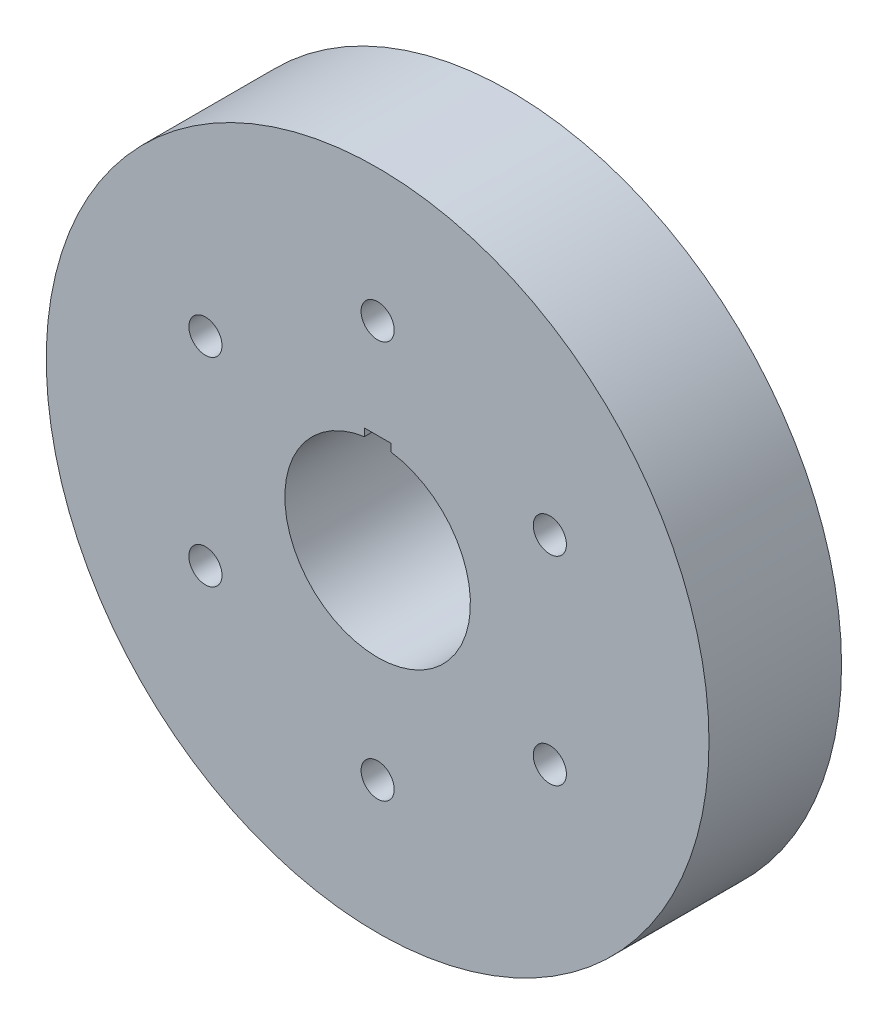
ISO-10303-21;
HEADER;
FILE_DESCRIPTION(('STEP AP214'),'2;1');
FILE_NAME('part.step','',(''),(''),'','','');
FILE_SCHEMA(('AUTOMOTIVE_DESIGN { 1 0 10303 214 1 1 1 1 }'));
ENDSEC;
DATA;
#1=APPLICATION_CONTEXT('core data for automotive mechanical design processes');
#2=APPLICATION_PROTOCOL_DEFINITION('international standard','automotive_design',2000,#1);
#3=PRODUCT_CONTEXT('',#1,'mechanical');
#4=PRODUCT('Part','Part','',(#3));
#5=PRODUCT_RELATED_PRODUCT_CATEGORY('part','',(#4));
#6=PRODUCT_DEFINITION_FORMATION('','',#4);
#7=PRODUCT_DEFINITION_CONTEXT('part definition',#1,'design');
#8=PRODUCT_DEFINITION('design','',#6,#7);
#9=PRODUCT_DEFINITION_SHAPE('','',#8);
#10=(LENGTH_UNIT() NAMED_UNIT(*) SI_UNIT(.MILLI.,.METRE.));
#11=(NAMED_UNIT(*) PLANE_ANGLE_UNIT() SI_UNIT($,.RADIAN.));
#12=(NAMED_UNIT(*) SI_UNIT($,.STERADIAN.) SOLID_ANGLE_UNIT());
#13=UNCERTAINTY_MEASURE_WITH_UNIT(LENGTH_MEASURE(1.E-05),#10,'distance_accuracy_value','');
#14=(GEOMETRIC_REPRESENTATION_CONTEXT(3) GLOBAL_UNCERTAINTY_ASSIGNED_CONTEXT((#13)) GLOBAL_UNIT_ASSIGNED_CONTEXT((#10,
#11,#12)) REPRESENTATION_CONTEXT('',''));
#15=CARTESIAN_POINT('',(0.,0.,0.));
#16=DIRECTION('',(0.,0.,1.));
#17=DIRECTION('',(1.,0.,0.));
#18=AXIS2_PLACEMENT_3D('',#15,#16,#17);
#19=CARTESIAN_POINT('',(0.,0.,20.));
#20=DIRECTION('',(0.,0.,1.));
#21=DIRECTION('',(1.,0.,0.));
#22=AXIS2_PLACEMENT_3D('',#19,#20,#21);
#23=PLANE('',#22);
#24=CARTESIAN_POINT('',(25.980762113533,-15.0000000000003,20.));
#25=DIRECTION('',(0.,0.,1.));
#26=DIRECTION('',(1.,0.,0.));
#27=AXIS2_PLACEMENT_3D('',#24,#25,#26);
#28=CIRCLE('',#27,2.5);
#29=CARTESIAN_POINT('',(28.480762113533,-15.0000000000003,20.));
#30=VERTEX_POINT('',#29);
#31=EDGE_CURVE('E242',#30,#30,#28,.T.);
#32=ORIENTED_EDGE('',*,*,#31,.F.);
#33=EDGE_LOOP('',(#32));
#34=FACE_BOUND('',#33,.T.);
#35=CARTESIAN_POINT('',(25.9807621135333,14.9999999999998,20.));
#36=DIRECTION('',(0.,0.,1.));
#37=DIRECTION('',(1.,0.,0.));
#38=AXIS2_PLACEMENT_3D('',#35,#36,#37);
#39=CIRCLE('',#38,2.5);
#40=CARTESIAN_POINT('',(28.4807621135333,14.9999999999998,20.));
#41=VERTEX_POINT('',#40);
#42=EDGE_CURVE('E244',#41,#41,#39,.T.);
#43=ORIENTED_EDGE('',*,*,#42,.F.);
#44=EDGE_LOOP('',(#43));
#45=FACE_BOUND('',#44,.T.);
#46=CARTESIAN_POINT('',(2.09489001666563E-13,30.,20.));
#47=DIRECTION('',(0.,0.,1.));
#48=DIRECTION('',(1.,0.,0.));
#49=AXIS2_PLACEMENT_3D('',#46,#47,#48);
#50=CIRCLE('',#49,2.5);
#51=CARTESIAN_POINT('',(2.50000000000021,30.,20.));
#52=VERTEX_POINT('',#51);
#53=EDGE_CURVE('E250',#52,#52,#50,.T.);
#54=ORIENTED_EDGE('',*,*,#53,.F.);
#55=EDGE_LOOP('',(#54));
#56=FACE_BOUND('',#55,.T.);
#57=CARTESIAN_POINT('',(-25.9807621135331,15.0000000000001,20.));
#58=DIRECTION('',(0.,0.,1.));
#59=DIRECTION('',(1.,0.,0.));
#60=AXIS2_PLACEMENT_3D('',#57,#58,#59);
#61=CIRCLE('',#60,2.5);
#62=CARTESIAN_POINT('',(-23.4807621135331,15.0000000000001,20.));
#63=VERTEX_POINT('',#62);
#64=EDGE_CURVE('E256',#63,#63,#61,.T.);
#65=ORIENTED_EDGE('',*,*,#64,.F.);
#66=EDGE_LOOP('',(#65));
#67=FACE_BOUND('',#66,.T.);
#68=CARTESIAN_POINT('',(-25.9807621135332,-14.9999999999999,20.));
#69=DIRECTION('',(0.,0.,1.));
#70=DIRECTION('',(1.,0.,0.));
#71=AXIS2_PLACEMENT_3D('',#68,#69,#70);
#72=CIRCLE('',#71,2.5);
#73=CARTESIAN_POINT('',(-23.4807621135332,-14.9999999999999,20.));
#74=VERTEX_POINT('',#73);
#75=EDGE_CURVE('E262',#74,#74,#72,.T.);
#76=ORIENTED_EDGE('',*,*,#75,.F.);
#77=EDGE_LOOP('',(#76));
#78=FACE_BOUND('',#77,.T.);
#79=CARTESIAN_POINT('',(0.,-30.,20.));
#80=DIRECTION('',(0.,0.,1.));
#81=DIRECTION('',(1.,0.,0.));
#82=AXIS2_PLACEMENT_3D('',#79,#80,#81);
#83=CIRCLE('',#82,2.5);
#84=CARTESIAN_POINT('',(2.5,-30.,20.));
#85=VERTEX_POINT('',#84);
#86=EDGE_CURVE('E268',#85,#85,#83,.T.);
#87=ORIENTED_EDGE('',*,*,#86,.F.);
#88=EDGE_LOOP('',(#87));
#89=FACE_BOUND('',#88,.T.);
#90=CARTESIAN_POINT('',(0.,0.,20.));
#91=DIRECTION('',(0.,0.,1.));
#92=DIRECTION('',(1.,0.,0.));
#93=AXIS2_PLACEMENT_3D('',#90,#91,#92);
#94=CIRCLE('',#93,50.);
#95=CARTESIAN_POINT('',(50.,0.,20.));
#96=VERTEX_POINT('',#95);
#97=EDGE_CURVE('E11',#96,#96,#94,.T.);
#98=ORIENTED_EDGE('',*,*,#97,.T.);
#99=EDGE_LOOP('',(#98));
#100=FACE_BOUND('',#99,.T.);
#101=DIRECTION('',(0.,1.,0.));
#102=VECTOR('',#101,1.);
#103=CARTESIAN_POINT('',(2.,15.,20.));
#104=LINE('',#103,#102);
#105=CARTESIAN_POINT('',(2.,13.856406460551,20.));
#106=VERTEX_POINT('',#105);
#107=CARTESIAN_POINT('',(2.,15.,20.));
#108=VERTEX_POINT('',#107);
#109=EDGE_CURVE('E84',#106,#108,#104,.T.);
#110=ORIENTED_EDGE('',*,*,#109,.F.);
#111=CARTESIAN_POINT('',(0.,0.,20.));
#112=DIRECTION('',(0.,0.,1.));
#113=DIRECTION('',(1.,0.,0.));
#114=AXIS2_PLACEMENT_3D('',#111,#112,#113);
#115=CIRCLE('',#114,14.);
#116=CARTESIAN_POINT('',(-2.,13.856406460551,20.));
#117=VERTEX_POINT('',#116);
#118=EDGE_CURVE('E76',#117,#106,#115,.T.);
#119=ORIENTED_EDGE('',*,*,#118,.F.);
#120=DIRECTION('',(0.,-1.,0.));
#121=VECTOR('',#120,1.);
#122=CARTESIAN_POINT('',(-2.,13.856406460551,20.));
#123=LINE('',#122,#121);
#124=CARTESIAN_POINT('',(-2.,15.,20.));
#125=VERTEX_POINT('',#124);
#126=EDGE_CURVE('E97',#125,#117,#123,.T.);
#127=ORIENTED_EDGE('',*,*,#126,.F.);
#128=DIRECTION('',(-1.,0.,0.));
#129=VECTOR('',#128,1.);
#130=CARTESIAN_POINT('',(-2.,15.,20.));
#131=LINE('',#130,#129);
#132=EDGE_CURVE('E95',#108,#125,#131,.T.);
#133=ORIENTED_EDGE('',*,*,#132,.F.);
#134=EDGE_LOOP('',(#110,#119,#127,#133));
#135=FACE_BOUND('',#134,.T.);
#136=ADVANCED_FACE('F35',(#34,#45,#56,#67,#78,#89,#100,#135),#23,.T.);
#137=CARTESIAN_POINT('',(0.,0.,0.));
#138=DIRECTION('',(0.,0.,1.));
#139=DIRECTION('',(1.,0.,0.));
#140=AXIS2_PLACEMENT_3D('',#137,#138,#139);
#141=PLANE('',#140);
#142=CARTESIAN_POINT('',(25.980762113533,-15.0000000000003,0.));
#143=DIRECTION('',(0.,0.,1.));
#144=DIRECTION('',(1.,0.,0.));
#145=AXIS2_PLACEMENT_3D('',#142,#143,#144);
#146=CIRCLE('',#145,2.5);
#147=CARTESIAN_POINT('',(28.480762113533,-15.0000000000003,0.));
#148=VERTEX_POINT('',#147);
#149=EDGE_CURVE('E240',#148,#148,#146,.T.);
#150=ORIENTED_EDGE('',*,*,#149,.T.);
#151=EDGE_LOOP('',(#150));
#152=FACE_BOUND('',#151,.T.);
#153=CARTESIAN_POINT('',(25.9807621135333,14.9999999999998,0.));
#154=DIRECTION('',(0.,0.,1.));
#155=DIRECTION('',(1.,0.,0.));
#156=AXIS2_PLACEMENT_3D('',#153,#154,#155);
#157=CIRCLE('',#156,2.5);
#158=CARTESIAN_POINT('',(28.4807621135333,14.9999999999998,0.));
#159=VERTEX_POINT('',#158);
#160=EDGE_CURVE('E247',#159,#159,#157,.T.);
#161=ORIENTED_EDGE('',*,*,#160,.T.);
#162=EDGE_LOOP('',(#161));
#163=FACE_BOUND('',#162,.T.);
#164=CARTESIAN_POINT('',(2.09489001666563E-13,30.,0.));
#165=DIRECTION('',(0.,0.,1.));
#166=DIRECTION('',(1.,0.,0.));
#167=AXIS2_PLACEMENT_3D('',#164,#165,#166);
#168=CIRCLE('',#167,2.5);
#169=CARTESIAN_POINT('',(2.50000000000021,30.,0.));
#170=VERTEX_POINT('',#169);
#171=EDGE_CURVE('E253',#170,#170,#168,.T.);
#172=ORIENTED_EDGE('',*,*,#171,.T.);
#173=EDGE_LOOP('',(#172));
#174=FACE_BOUND('',#173,.T.);
#175=CARTESIAN_POINT('',(-25.9807621135331,15.0000000000001,0.));
#176=DIRECTION('',(0.,0.,1.));
#177=DIRECTION('',(1.,0.,0.));
#178=AXIS2_PLACEMENT_3D('',#175,#176,#177);
#179=CIRCLE('',#178,2.5);
#180=CARTESIAN_POINT('',(-23.4807621135331,15.0000000000001,0.));
#181=VERTEX_POINT('',#180);
#182=EDGE_CURVE('E259',#181,#181,#179,.T.);
#183=ORIENTED_EDGE('',*,*,#182,.T.);
#184=EDGE_LOOP('',(#183));
#185=FACE_BOUND('',#184,.T.);
#186=CARTESIAN_POINT('',(-25.9807621135332,-14.9999999999999,0.));
#187=DIRECTION('',(0.,0.,1.));
#188=DIRECTION('',(1.,0.,0.));
#189=AXIS2_PLACEMENT_3D('',#186,#187,#188);
#190=CIRCLE('',#189,2.5);
#191=CARTESIAN_POINT('',(-23.4807621135332,-14.9999999999999,0.));
#192=VERTEX_POINT('',#191);
#193=EDGE_CURVE('E265',#192,#192,#190,.T.);
#194=ORIENTED_EDGE('',*,*,#193,.T.);
#195=EDGE_LOOP('',(#194));
#196=FACE_BOUND('',#195,.T.);
#197=CARTESIAN_POINT('',(0.,-30.,0.));
#198=DIRECTION('',(0.,0.,1.));
#199=DIRECTION('',(1.,0.,0.));
#200=AXIS2_PLACEMENT_3D('',#197,#198,#199);
#201=CIRCLE('',#200,2.5);
#202=CARTESIAN_POINT('',(2.5,-30.,0.));
#203=VERTEX_POINT('',#202);
#204=EDGE_CURVE('E103',#203,#203,#201,.T.);
#205=ORIENTED_EDGE('',*,*,#204,.T.);
#206=EDGE_LOOP('',(#205));
#207=FACE_BOUND('',#206,.T.);
#208=CARTESIAN_POINT('',(0.,0.,0.));
#209=DIRECTION('',(0.,0.,1.));
#210=DIRECTION('',(1.,0.,0.));
#211=AXIS2_PLACEMENT_3D('',#208,#209,#210);
#212=CIRCLE('',#211,50.);
#213=CARTESIAN_POINT('',(50.,0.,0.));
#214=VERTEX_POINT('',#213);
#215=EDGE_CURVE('E39',#214,#214,#212,.T.);
#216=ORIENTED_EDGE('',*,*,#215,.F.);
#217=EDGE_LOOP('',(#216));
#218=FACE_BOUND('',#217,.T.);
#219=CARTESIAN_POINT('',(0.,0.,0.));
#220=DIRECTION('',(0.,0.,1.));
#221=DIRECTION('',(1.,0.,0.));
#222=AXIS2_PLACEMENT_3D('',#219,#220,#221);
#223=CIRCLE('',#222,14.);
#224=CARTESIAN_POINT('',(-2.,13.856406460551,0.));
#225=VERTEX_POINT('',#224);
#226=CARTESIAN_POINT('',(2.,13.856406460551,0.));
#227=VERTEX_POINT('',#226);
#228=EDGE_CURVE('E58',#225,#227,#223,.T.);
#229=ORIENTED_EDGE('',*,*,#228,.T.);
#230=DIRECTION('',(0.,1.,0.));
#231=VECTOR('',#230,1.);
#232=CARTESIAN_POINT('',(2.,15.,0.));
#233=LINE('',#232,#231);
#234=CARTESIAN_POINT('',(2.,15.,0.));
#235=VERTEX_POINT('',#234);
#236=EDGE_CURVE('E91',#227,#235,#233,.T.);
#237=ORIENTED_EDGE('',*,*,#236,.T.);
#238=DIRECTION('',(-1.,0.,0.));
#239=VECTOR('',#238,1.);
#240=CARTESIAN_POINT('',(-2.,15.,0.));
#241=LINE('',#240,#239);
#242=CARTESIAN_POINT('',(-2.,15.,0.));
#243=VERTEX_POINT('',#242);
#244=EDGE_CURVE('E105',#235,#243,#241,.T.);
#245=ORIENTED_EDGE('',*,*,#244,.T.);
#246=DIRECTION('',(0.,-1.,0.));
#247=VECTOR('',#246,1.);
#248=CARTESIAN_POINT('',(-2.,13.856406460551,0.));
#249=LINE('',#248,#247);
#250=EDGE_CURVE('E85',#243,#225,#249,.T.);
#251=ORIENTED_EDGE('',*,*,#250,.T.);
#252=EDGE_LOOP('',(#229,#237,#245,#251));
#253=FACE_BOUND('',#252,.T.);
#254=ADVANCED_FACE('F116',(#152,#163,#174,#185,#196,#207,#218,#253),#141,.F.);
#255=CARTESIAN_POINT('',(0.,0.,20.));
#256=DIRECTION('',(0.,0.,-1.));
#257=DIRECTION('',(-1.,0.,0.));
#258=AXIS2_PLACEMENT_3D('',#255,#256,#257);
#259=CYLINDRICAL_SURFACE('',#258,50.);
#260=ORIENTED_EDGE('',*,*,#97,.F.);
#261=EDGE_LOOP('',(#260));
#262=FACE_BOUND('',#261,.T.);
#263=ORIENTED_EDGE('',*,*,#215,.T.);
#264=EDGE_LOOP('',(#263));
#265=FACE_BOUND('',#264,.T.);
#266=ADVANCED_FACE('F37',(#262,#265),#259,.T.);
#267=CARTESIAN_POINT('',(0.,0.,20.));
#268=DIRECTION('',(0.,0.,-1.));
#269=DIRECTION('',(-1.,0.,0.));
#270=AXIS2_PLACEMENT_3D('',#267,#268,#269);
#271=CYLINDRICAL_SURFACE('',#270,14.);
#272=ORIENTED_EDGE('',*,*,#228,.F.);
#273=DIRECTION('',(0.,0.,-1.));
#274=VECTOR('',#273,1.);
#275=CARTESIAN_POINT('',(-2.,13.856406460551,20.));
#276=LINE('',#275,#274);
#277=EDGE_CURVE('E80',#117,#225,#276,.T.);
#278=ORIENTED_EDGE('',*,*,#277,.F.);
#279=ORIENTED_EDGE('',*,*,#118,.T.);
#280=DIRECTION('',(0.,0.,-1.));
#281=VECTOR('',#280,1.);
#282=CARTESIAN_POINT('',(2.,13.856406460551,20.));
#283=LINE('',#282,#281);
#284=EDGE_CURVE('E79',#106,#227,#283,.T.);
#285=ORIENTED_EDGE('',*,*,#284,.T.);
#286=EDGE_LOOP('',(#272,#278,#279,#285));
#287=FACE_BOUND('',#286,.T.);
#288=ADVANCED_FACE('F78',(#287),#271,.F.);
#289=CARTESIAN_POINT('',(2.,15.,20.));
#290=DIRECTION('',(-1.,0.,0.));
#291=DIRECTION('',(0.,0.,1.));
#292=AXIS2_PLACEMENT_3D('',#289,#290,#291);
#293=PLANE('',#292);
#294=ORIENTED_EDGE('',*,*,#236,.F.);
#295=ORIENTED_EDGE('',*,*,#284,.F.);
#296=ORIENTED_EDGE('',*,*,#109,.T.);
#297=DIRECTION('',(0.,0.,-1.));
#298=VECTOR('',#297,1.);
#299=CARTESIAN_POINT('',(2.,15.,20.));
#300=LINE('',#299,#298);
#301=EDGE_CURVE('E92',#108,#235,#300,.T.);
#302=ORIENTED_EDGE('',*,*,#301,.T.);
#303=EDGE_LOOP('',(#294,#295,#296,#302));
#304=FACE_BOUND('',#303,.T.);
#305=ADVANCED_FACE('F88',(#304),#293,.T.);
#306=CARTESIAN_POINT('',(-2.,15.,20.));
#307=DIRECTION('',(0.,-1.,0.));
#308=DIRECTION('',(0.,0.,-1.));
#309=AXIS2_PLACEMENT_3D('',#306,#307,#308);
#310=PLANE('',#309);
#311=ORIENTED_EDGE('',*,*,#244,.F.);
#312=ORIENTED_EDGE('',*,*,#301,.F.);
#313=ORIENTED_EDGE('',*,*,#132,.T.);
#314=DIRECTION('',(0.,0.,-1.));
#315=VECTOR('',#314,1.);
#316=CARTESIAN_POINT('',(-2.,15.,20.));
#317=LINE('',#316,#315);
#318=EDGE_CURVE('E50',#125,#243,#317,.T.);
#319=ORIENTED_EDGE('',*,*,#318,.T.);
#320=EDGE_LOOP('',(#311,#312,#313,#319));
#321=FACE_BOUND('',#320,.T.);
#322=ADVANCED_FACE('F114',(#321),#310,.T.);
#323=CARTESIAN_POINT('',(-2.,13.856406460551,20.));
#324=DIRECTION('',(1.,0.,0.));
#325=DIRECTION('',(0.,0.,-1.));
#326=AXIS2_PLACEMENT_3D('',#323,#324,#325);
#327=PLANE('',#326);
#328=ORIENTED_EDGE('',*,*,#250,.F.);
#329=ORIENTED_EDGE('',*,*,#318,.F.);
#330=ORIENTED_EDGE('',*,*,#126,.T.);
#331=ORIENTED_EDGE('',*,*,#277,.T.);
#332=EDGE_LOOP('',(#328,#329,#330,#331));
#333=FACE_BOUND('',#332,.T.);
#334=ADVANCED_FACE('F117',(#333),#327,.T.);
#335=CARTESIAN_POINT('',(0.,-30.,0.));
#336=DIRECTION('',(0.,0.,1.));
#337=DIRECTION('',(1.,0.,0.));
#338=AXIS2_PLACEMENT_3D('',#335,#336,#337);
#339=CYLINDRICAL_SURFACE('',#338,2.5);
#340=ORIENTED_EDGE('',*,*,#204,.F.);
#341=EDGE_LOOP('',(#340));
#342=FACE_BOUND('',#341,.T.);
#343=ORIENTED_EDGE('',*,*,#86,.T.);
#344=EDGE_LOOP('',(#343));
#345=FACE_BOUND('',#344,.T.);
#346=ADVANCED_FACE('F119',(#342,#345),#339,.F.);
#347=CARTESIAN_POINT('',(-25.9807621135332,-14.9999999999999,0.));
#348=DIRECTION('',(0.,0.,1.));
#349=DIRECTION('',(1.,0.,0.));
#350=AXIS2_PLACEMENT_3D('',#347,#348,#349);
#351=CYLINDRICAL_SURFACE('',#350,2.5);
#352=ORIENTED_EDGE('',*,*,#193,.F.);
#353=EDGE_LOOP('',(#352));
#354=FACE_BOUND('',#353,.T.);
#355=ORIENTED_EDGE('',*,*,#75,.T.);
#356=EDGE_LOOP('',(#355));
#357=FACE_BOUND('',#356,.T.);
#358=ADVANCED_FACE('F125',(#354,#357),#351,.F.);
#359=CARTESIAN_POINT('',(-25.9807621135331,15.0000000000001,0.));
#360=DIRECTION('',(0.,0.,1.));
#361=DIRECTION('',(1.,0.,0.));
#362=AXIS2_PLACEMENT_3D('',#359,#360,#361);
#363=CYLINDRICAL_SURFACE('',#362,2.5);
#364=ORIENTED_EDGE('',*,*,#182,.F.);
#365=EDGE_LOOP('',(#364));
#366=FACE_BOUND('',#365,.T.);
#367=ORIENTED_EDGE('',*,*,#64,.T.);
#368=EDGE_LOOP('',(#367));
#369=FACE_BOUND('',#368,.T.);
#370=ADVANCED_FACE('F184',(#366,#369),#363,.F.);
#371=CARTESIAN_POINT('',(2.09489001666563E-13,30.,0.));
#372=DIRECTION('',(0.,0.,1.));
#373=DIRECTION('',(1.,0.,0.));
#374=AXIS2_PLACEMENT_3D('',#371,#372,#373);
#375=CYLINDRICAL_SURFACE('',#374,2.5);
#376=ORIENTED_EDGE('',*,*,#171,.F.);
#377=EDGE_LOOP('',(#376));
#378=FACE_BOUND('',#377,.T.);
#379=ORIENTED_EDGE('',*,*,#53,.T.);
#380=EDGE_LOOP('',(#379));
#381=FACE_BOUND('',#380,.T.);
#382=ADVANCED_FACE('F196',(#378,#381),#375,.F.);
#383=CARTESIAN_POINT('',(25.9807621135333,14.9999999999998,0.));
#384=DIRECTION('',(0.,0.,1.));
#385=DIRECTION('',(1.,0.,0.));
#386=AXIS2_PLACEMENT_3D('',#383,#384,#385);
#387=CYLINDRICAL_SURFACE('',#386,2.5);
#388=ORIENTED_EDGE('',*,*,#160,.F.);
#389=EDGE_LOOP('',(#388));
#390=FACE_BOUND('',#389,.T.);
#391=ORIENTED_EDGE('',*,*,#42,.T.);
#392=EDGE_LOOP('',(#391));
#393=FACE_BOUND('',#392,.T.);
#394=ADVANCED_FACE('F207',(#390,#393),#387,.F.);
#395=CARTESIAN_POINT('',(25.980762113533,-15.0000000000003,0.));
#396=DIRECTION('',(0.,0.,1.));
#397=DIRECTION('',(1.,0.,0.));
#398=AXIS2_PLACEMENT_3D('',#395,#396,#397);
#399=CYLINDRICAL_SURFACE('',#398,2.5);
#400=ORIENTED_EDGE('',*,*,#149,.F.);
#401=EDGE_LOOP('',(#400));
#402=FACE_BOUND('',#401,.T.);
#403=ORIENTED_EDGE('',*,*,#31,.T.);
#404=EDGE_LOOP('',(#403));
#405=FACE_BOUND('',#404,.T.);
#406=ADVANCED_FACE('F217',(#402,#405),#399,.F.);
#407=CLOSED_SHELL('',(#136,#254,#266,#288,#305,#322,#334,#346,#358,#370,#382,#394,#406));
#408=MANIFOLD_SOLID_BREP('B2',#407);
#409=ADVANCED_BREP_SHAPE_REPRESENTATION('',(#18,#408),#14);
#410=SHAPE_DEFINITION_REPRESENTATION(#9,#409);
ENDSEC;
END-ISO-10303-21;
